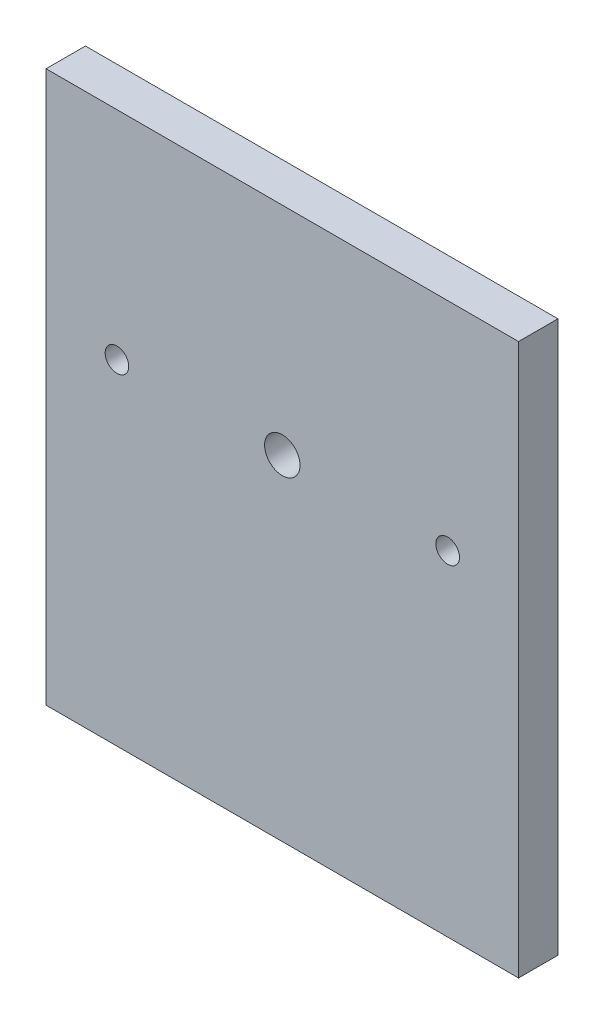
ISO-10303-21;
HEADER;
FILE_DESCRIPTION(('STEP AP214'),'2;1');
FILE_NAME('part.step','',(''),(''),'','','');
FILE_SCHEMA(('AUTOMOTIVE_DESIGN { 1 0 10303 214 1 1 1 1 }'));
ENDSEC;
DATA;
#1=APPLICATION_CONTEXT('core data for automotive mechanical design processes');
#2=APPLICATION_PROTOCOL_DEFINITION('international standard','automotive_design',2000,#1);
#3=PRODUCT_CONTEXT('',#1,'mechanical');
#4=PRODUCT('Part','Part','',(#3));
#5=PRODUCT_RELATED_PRODUCT_CATEGORY('part','',(#4));
#6=PRODUCT_DEFINITION_FORMATION('','',#4);
#7=PRODUCT_DEFINITION_CONTEXT('part definition',#1,'design');
#8=PRODUCT_DEFINITION('design','',#6,#7);
#9=PRODUCT_DEFINITION_SHAPE('','',#8);
#10=(LENGTH_UNIT() NAMED_UNIT(*) SI_UNIT(.MILLI.,.METRE.));
#11=(NAMED_UNIT(*) PLANE_ANGLE_UNIT() SI_UNIT($,.RADIAN.));
#12=(NAMED_UNIT(*) SI_UNIT($,.STERADIAN.) SOLID_ANGLE_UNIT());
#13=UNCERTAINTY_MEASURE_WITH_UNIT(LENGTH_MEASURE(1.E-05),#10,'distance_accuracy_value','');
#14=(GEOMETRIC_REPRESENTATION_CONTEXT(3) GLOBAL_UNCERTAINTY_ASSIGNED_CONTEXT((#13)) GLOBAL_UNIT_ASSIGNED_CONTEXT((#10,
#11,#12)) REPRESENTATION_CONTEXT('',''));
#15=CARTESIAN_POINT('',(0.,0.,0.));
#16=DIRECTION('',(0.,0.,1.));
#17=DIRECTION('',(1.,0.,0.));
#18=AXIS2_PLACEMENT_3D('',#15,#16,#17);
#19=CARTESIAN_POINT('',(0.,0.,10.));
#20=DIRECTION('',(0.,0.,-1.));
#21=DIRECTION('',(-1.,0.,0.));
#22=AXIS2_PLACEMENT_3D('',#19,#20,#21);
#23=PLANE('',#22);
#24=DIRECTION('',(0.,1.,0.));
#25=VECTOR('',#24,1.);
#26=CARTESIAN_POINT('',(0.,0.,10.));
#27=LINE('',#26,#25);
#28=CARTESIAN_POINT('',(0.,-140.,10.));
#29=VERTEX_POINT('',#28);
#30=CARTESIAN_POINT('',(0.,0.,10.));
#31=VERTEX_POINT('',#30);
#32=EDGE_CURVE('E86',#29,#31,#27,.T.);
#33=ORIENTED_EDGE('',*,*,#32,.T.);
#34=DIRECTION('',(-1.,0.,0.));
#35=VECTOR('',#34,1.);
#36=CARTESIAN_POINT('',(0.,0.,10.));
#37=LINE('',#36,#35);
#38=CARTESIAN_POINT('',(-120.,0.,10.));
#39=VERTEX_POINT('',#38);
#40=EDGE_CURVE('E81',#31,#39,#37,.T.);
#41=ORIENTED_EDGE('',*,*,#40,.T.);
#42=DIRECTION('',(0.,-1.,0.));
#43=VECTOR('',#42,1.);
#44=CARTESIAN_POINT('',(-120.,0.,10.));
#45=LINE('',#44,#43);
#46=CARTESIAN_POINT('',(-120.,-140.,10.));
#47=VERTEX_POINT('',#46);
#48=EDGE_CURVE('E84',#39,#47,#45,.T.);
#49=ORIENTED_EDGE('',*,*,#48,.T.);
#50=DIRECTION('',(1.,0.,0.));
#51=VECTOR('',#50,1.);
#52=CARTESIAN_POINT('',(0.,-140.,10.));
#53=LINE('',#52,#51);
#54=EDGE_CURVE('E51',#47,#29,#53,.T.);
#55=ORIENTED_EDGE('',*,*,#54,.T.);
#56=EDGE_LOOP('',(#33,#41,#49,#55));
#57=FACE_BOUND('',#56,.T.);
#58=CARTESIAN_POINT('',(-60.,-55.,10.));
#59=DIRECTION('',(0.,0.,1.));
#60=DIRECTION('',(1.,0.,0.));
#61=AXIS2_PLACEMENT_3D('',#58,#59,#60);
#62=CIRCLE('',#61,4.50000000000001);
#63=CARTESIAN_POINT('',(-55.5,-55.,10.));
#64=VERTEX_POINT('',#63);
#65=EDGE_CURVE('E101',#64,#64,#62,.T.);
#66=ORIENTED_EDGE('',*,*,#65,.F.);
#67=EDGE_LOOP('',(#66));
#68=FACE_BOUND('',#67,.T.);
#69=CARTESIAN_POINT('',(-102.,-55.,10.));
#70=DIRECTION('',(0.,0.,1.));
#71=DIRECTION('',(1.,0.,0.));
#72=AXIS2_PLACEMENT_3D('',#69,#70,#71);
#73=CIRCLE('',#72,3.00000000000001);
#74=CARTESIAN_POINT('',(-99.,-55.,10.));
#75=VERTEX_POINT('',#74);
#76=EDGE_CURVE('E116',#75,#75,#73,.T.);
#77=ORIENTED_EDGE('',*,*,#76,.F.);
#78=EDGE_LOOP('',(#77));
#79=FACE_BOUND('',#78,.T.);
#80=CARTESIAN_POINT('',(-18.,-55.,10.));
#81=DIRECTION('',(0.,0.,1.));
#82=DIRECTION('',(1.,0.,0.));
#83=AXIS2_PLACEMENT_3D('',#80,#81,#82);
#84=CIRCLE('',#83,3.);
#85=CARTESIAN_POINT('',(-15.,-55.,10.));
#86=VERTEX_POINT('',#85);
#87=EDGE_CURVE('E122',#86,#86,#84,.T.);
#88=ORIENTED_EDGE('',*,*,#87,.F.);
#89=EDGE_LOOP('',(#88));
#90=FACE_BOUND('',#89,.T.);
#91=ADVANCED_FACE('F34',(#57,#68,#79,#90),#23,.F.);
#92=CARTESIAN_POINT('',(0.,0.,0.));
#93=DIRECTION('',(0.,0.,-1.));
#94=DIRECTION('',(-1.,0.,0.));
#95=AXIS2_PLACEMENT_3D('',#92,#93,#94);
#96=PLANE('',#95);
#97=CARTESIAN_POINT('',(-102.,-55.,0.));
#98=DIRECTION('',(0.,0.,1.));
#99=DIRECTION('',(1.,0.,0.));
#100=AXIS2_PLACEMENT_3D('',#97,#98,#99);
#101=CIRCLE('',#100,3.00000000000001);
#102=CARTESIAN_POINT('',(-99.,-55.,0.));
#103=VERTEX_POINT('',#102);
#104=EDGE_CURVE('E119',#103,#103,#101,.T.);
#105=ORIENTED_EDGE('',*,*,#104,.T.);
#106=EDGE_LOOP('',(#105));
#107=FACE_BOUND('',#106,.T.);
#108=DIRECTION('',(0.,1.,0.));
#109=VECTOR('',#108,1.);
#110=CARTESIAN_POINT('',(0.,0.,0.));
#111=LINE('',#110,#109);
#112=CARTESIAN_POINT('',(0.,-140.,0.));
#113=VERTEX_POINT('',#112);
#114=CARTESIAN_POINT('',(0.,0.,0.));
#115=VERTEX_POINT('',#114);
#116=EDGE_CURVE('E98',#113,#115,#111,.T.);
#117=ORIENTED_EDGE('',*,*,#116,.F.);
#118=DIRECTION('',(1.,0.,0.));
#119=VECTOR('',#118,1.);
#120=CARTESIAN_POINT('',(0.,-140.,0.));
#121=LINE('',#120,#119);
#122=CARTESIAN_POINT('',(-120.,-140.,0.));
#123=VERTEX_POINT('',#122);
#124=EDGE_CURVE('E74',#123,#113,#121,.T.);
#125=ORIENTED_EDGE('',*,*,#124,.F.);
#126=DIRECTION('',(0.,-1.,0.));
#127=VECTOR('',#126,1.);
#128=CARTESIAN_POINT('',(-120.,0.,0.));
#129=LINE('',#128,#127);
#130=CARTESIAN_POINT('',(-120.,0.,0.));
#131=VERTEX_POINT('',#130);
#132=EDGE_CURVE('E68',#131,#123,#129,.T.);
#133=ORIENTED_EDGE('',*,*,#132,.F.);
#134=DIRECTION('',(-1.,0.,0.));
#135=VECTOR('',#134,1.);
#136=CARTESIAN_POINT('',(0.,0.,0.));
#137=LINE('',#136,#135);
#138=EDGE_CURVE('E90',#115,#131,#137,.T.);
#139=ORIENTED_EDGE('',*,*,#138,.F.);
#140=EDGE_LOOP('',(#117,#125,#133,#139));
#141=FACE_BOUND('',#140,.T.);
#142=CARTESIAN_POINT('',(-60.,-55.,0.));
#143=DIRECTION('',(0.,0.,1.));
#144=DIRECTION('',(1.,0.,0.));
#145=AXIS2_PLACEMENT_3D('',#142,#143,#144);
#146=CIRCLE('',#145,4.50000000000001);
#147=CARTESIAN_POINT('',(-55.5,-55.,0.));
#148=VERTEX_POINT('',#147);
#149=EDGE_CURVE('E113',#148,#148,#146,.T.);
#150=ORIENTED_EDGE('',*,*,#149,.T.);
#151=EDGE_LOOP('',(#150));
#152=FACE_BOUND('',#151,.T.);
#153=CARTESIAN_POINT('',(-18.,-55.,0.));
#154=DIRECTION('',(0.,0.,1.));
#155=DIRECTION('',(1.,0.,0.));
#156=AXIS2_PLACEMENT_3D('',#153,#154,#155);
#157=CIRCLE('',#156,3.);
#158=CARTESIAN_POINT('',(-15.,-55.,0.));
#159=VERTEX_POINT('',#158);
#160=EDGE_CURVE('E125',#159,#159,#157,.T.);
#161=ORIENTED_EDGE('',*,*,#160,.T.);
#162=EDGE_LOOP('',(#161));
#163=FACE_BOUND('',#162,.T.);
#164=ADVANCED_FACE('F109',(#107,#141,#152,#163),#96,.T.);
#165=CARTESIAN_POINT('',(0.,0.,10.));
#166=DIRECTION('',(-1.,0.,0.));
#167=DIRECTION('',(0.,-1.,0.));
#168=AXIS2_PLACEMENT_3D('',#165,#166,#167);
#169=PLANE('',#168);
#170=ORIENTED_EDGE('',*,*,#116,.T.);
#171=DIRECTION('',(0.,0.,-1.));
#172=VECTOR('',#171,1.);
#173=CARTESIAN_POINT('',(0.,0.,10.));
#174=LINE('',#173,#172);
#175=EDGE_CURVE('E11',#31,#115,#174,.T.);
#176=ORIENTED_EDGE('',*,*,#175,.F.);
#177=ORIENTED_EDGE('',*,*,#32,.F.);
#178=DIRECTION('',(0.,0.,-1.));
#179=VECTOR('',#178,1.);
#180=CARTESIAN_POINT('',(0.,-140.,10.));
#181=LINE('',#180,#179);
#182=EDGE_CURVE('E94',#29,#113,#181,.T.);
#183=ORIENTED_EDGE('',*,*,#182,.T.);
#184=EDGE_LOOP('',(#170,#176,#177,#183));
#185=FACE_BOUND('',#184,.T.);
#186=ADVANCED_FACE('F36',(#185),#169,.F.);
#187=CARTESIAN_POINT('',(0.,0.,10.));
#188=DIRECTION('',(0.,-1.,0.));
#189=DIRECTION('',(1.,0.,0.));
#190=AXIS2_PLACEMENT_3D('',#187,#188,#189);
#191=PLANE('',#190);
#192=ORIENTED_EDGE('',*,*,#138,.T.);
#193=DIRECTION('',(0.,0.,-1.));
#194=VECTOR('',#193,1.);
#195=CARTESIAN_POINT('',(-120.,0.,10.));
#196=LINE('',#195,#194);
#197=EDGE_CURVE('E43',#39,#131,#196,.T.);
#198=ORIENTED_EDGE('',*,*,#197,.F.);
#199=ORIENTED_EDGE('',*,*,#40,.F.);
#200=ORIENTED_EDGE('',*,*,#175,.T.);
#201=EDGE_LOOP('',(#192,#198,#199,#200));
#202=FACE_BOUND('',#201,.T.);
#203=ADVANCED_FACE('F89',(#202),#191,.F.);
#204=CARTESIAN_POINT('',(-120.,0.,10.));
#205=DIRECTION('',(1.,0.,0.));
#206=DIRECTION('',(0.,1.,0.));
#207=AXIS2_PLACEMENT_3D('',#204,#205,#206);
#208=PLANE('',#207);
#209=ORIENTED_EDGE('',*,*,#132,.T.);
#210=DIRECTION('',(0.,0.,-1.));
#211=VECTOR('',#210,1.);
#212=CARTESIAN_POINT('',(-120.,-140.,10.));
#213=LINE('',#212,#211);
#214=EDGE_CURVE('E91',#47,#123,#213,.T.);
#215=ORIENTED_EDGE('',*,*,#214,.F.);
#216=ORIENTED_EDGE('',*,*,#48,.F.);
#217=ORIENTED_EDGE('',*,*,#197,.T.);
#218=EDGE_LOOP('',(#209,#215,#216,#217));
#219=FACE_BOUND('',#218,.T.);
#220=ADVANCED_FACE('F92',(#219),#208,.F.);
#221=CARTESIAN_POINT('',(0.,-140.,10.));
#222=DIRECTION('',(0.,1.,0.));
#223=DIRECTION('',(0.,0.,1.));
#224=AXIS2_PLACEMENT_3D('',#221,#222,#223);
#225=PLANE('',#224);
#226=ORIENTED_EDGE('',*,*,#124,.T.);
#227=ORIENTED_EDGE('',*,*,#182,.F.);
#228=ORIENTED_EDGE('',*,*,#54,.F.);
#229=ORIENTED_EDGE('',*,*,#214,.T.);
#230=EDGE_LOOP('',(#226,#227,#228,#229));
#231=FACE_BOUND('',#230,.T.);
#232=ADVANCED_FACE('F106',(#231),#225,.F.);
#233=CARTESIAN_POINT('',(-60.,-55.,10.));
#234=DIRECTION('',(0.,0.,-1.));
#235=DIRECTION('',(-1.,0.,0.));
#236=AXIS2_PLACEMENT_3D('',#233,#234,#235);
#237=CYLINDRICAL_SURFACE('',#236,4.50000000000001);
#238=ORIENTED_EDGE('',*,*,#65,.T.);
#239=EDGE_LOOP('',(#238));
#240=FACE_BOUND('',#239,.T.);
#241=ORIENTED_EDGE('',*,*,#149,.F.);
#242=EDGE_LOOP('',(#241));
#243=FACE_BOUND('',#242,.T.);
#244=ADVANCED_FACE('F142',(#240,#243),#237,.F.);
#245=CARTESIAN_POINT('',(-102.,-55.,10.));
#246=DIRECTION('',(0.,0.,-1.));
#247=DIRECTION('',(-1.,0.,0.));
#248=AXIS2_PLACEMENT_3D('',#245,#246,#247);
#249=CYLINDRICAL_SURFACE('',#248,3.00000000000001);
#250=ORIENTED_EDGE('',*,*,#76,.T.);
#251=EDGE_LOOP('',(#250));
#252=FACE_BOUND('',#251,.T.);
#253=ORIENTED_EDGE('',*,*,#104,.F.);
#254=EDGE_LOOP('',(#253));
#255=FACE_BOUND('',#254,.T.);
#256=ADVANCED_FACE('F188',(#252,#255),#249,.F.);
#257=CARTESIAN_POINT('',(-18.,-55.,10.));
#258=DIRECTION('',(0.,0.,-1.));
#259=DIRECTION('',(-1.,0.,0.));
#260=AXIS2_PLACEMENT_3D('',#257,#258,#259);
#261=CYLINDRICAL_SURFACE('',#260,3.);
#262=ORIENTED_EDGE('',*,*,#87,.T.);
#263=EDGE_LOOP('',(#262));
#264=FACE_BOUND('',#263,.T.);
#265=ORIENTED_EDGE('',*,*,#160,.F.);
#266=EDGE_LOOP('',(#265));
#267=FACE_BOUND('',#266,.T.);
#268=ADVANCED_FACE('F131',(#264,#267),#261,.F.);
#269=CLOSED_SHELL('',(#91,#164,#186,#203,#220,#232,#244,#256,#268));
#270=MANIFOLD_SOLID_BREP('B2',#269);
#271=ADVANCED_BREP_SHAPE_REPRESENTATION('',(#18,#270),#14);
#272=SHAPE_DEFINITION_REPRESENTATION(#9,#271);
ENDSEC;
END-ISO-10303-21;
